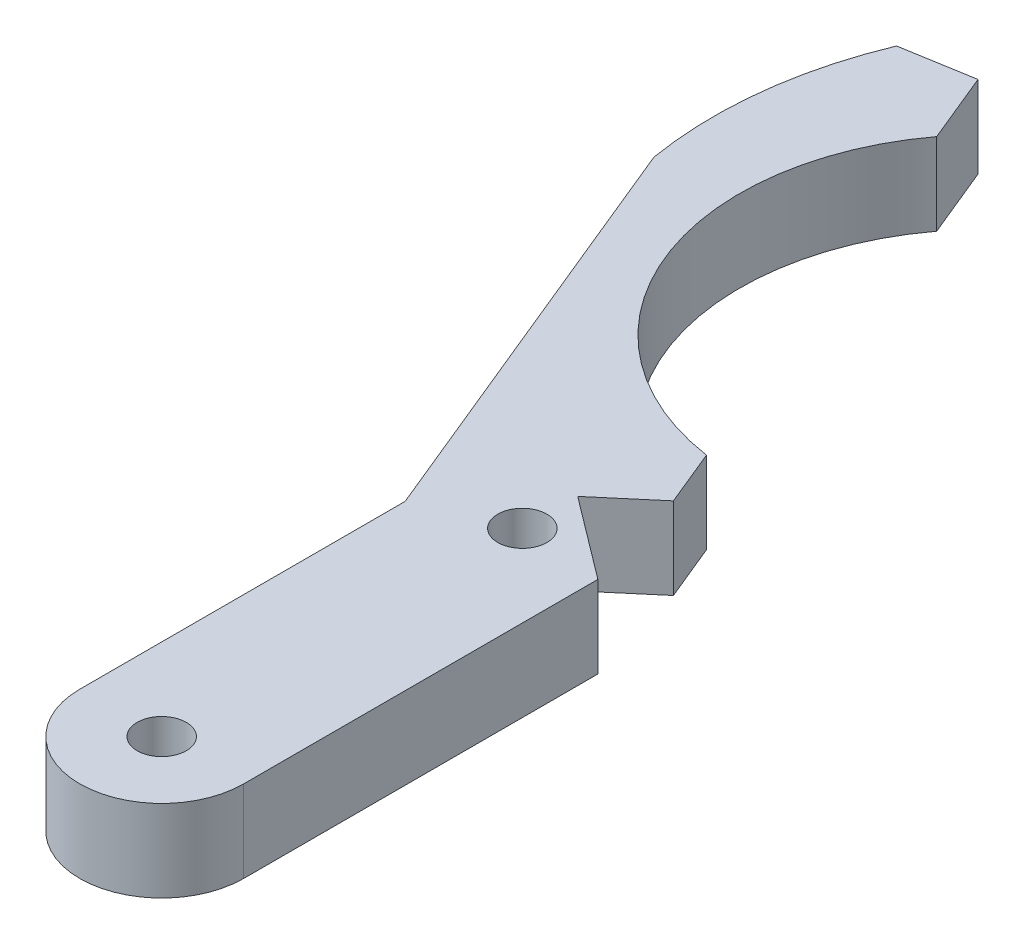
ISO-10303-21;
HEADER;
FILE_DESCRIPTION(('STEP AP214'),'2;1');
FILE_NAME('part.step','',(''),(''),'','','');
FILE_SCHEMA(('AUTOMOTIVE_DESIGN { 1 0 10303 214 1 1 1 1 }'));
ENDSEC;
DATA;
#1=APPLICATION_CONTEXT('core data for automotive mechanical design processes');
#2=APPLICATION_PROTOCOL_DEFINITION('international standard','automotive_design',2000,#1);
#3=PRODUCT_CONTEXT('',#1,'mechanical');
#4=PRODUCT('Part','Part','',(#3));
#5=PRODUCT_RELATED_PRODUCT_CATEGORY('part','',(#4));
#6=PRODUCT_DEFINITION_FORMATION('','',#4);
#7=PRODUCT_DEFINITION_CONTEXT('part definition',#1,'design');
#8=PRODUCT_DEFINITION('design','',#6,#7);
#9=PRODUCT_DEFINITION_SHAPE('','',#8);
#10=(LENGTH_UNIT() NAMED_UNIT(*) SI_UNIT(.MILLI.,.METRE.));
#11=(NAMED_UNIT(*) PLANE_ANGLE_UNIT() SI_UNIT($,.RADIAN.));
#12=(NAMED_UNIT(*) SI_UNIT($,.STERADIAN.) SOLID_ANGLE_UNIT());
#13=UNCERTAINTY_MEASURE_WITH_UNIT(LENGTH_MEASURE(1.E-05),#10,'distance_accuracy_value','');
#14=(GEOMETRIC_REPRESENTATION_CONTEXT(3) GLOBAL_UNCERTAINTY_ASSIGNED_CONTEXT((#13)) GLOBAL_UNIT_ASSIGNED_CONTEXT((#10,
#11,#12)) REPRESENTATION_CONTEXT('',''));
#15=CARTESIAN_POINT('',(0.,0.,0.));
#16=DIRECTION('',(0.,0.,1.));
#17=DIRECTION('',(1.,0.,0.));
#18=AXIS2_PLACEMENT_3D('',#15,#16,#17);
#19=CARTESIAN_POINT('',(-19.3539708974795,5.,7.95737946821825));
#20=DIRECTION('',(-0.924878228166552,0.,0.380263412733199));
#21=DIRECTION('',(0.380263412733199,0.,0.924878228166552));
#22=AXIS2_PLACEMENT_3D('',#19,#20,#21);
#23=PLANE('',#22);
#24=DIRECTION('',(-0.380263412733199,0.,-0.924878228166552));
#25=VECTOR('',#24,1.);
#26=CARTESIAN_POINT('',(-19.3539708974795,0.,7.95737946821825));
#27=LINE('',#26,#25);
#28=CARTESIAN_POINT('',(-30.7869668246445,0.,-19.85));
#29=VERTEX_POINT('',#28);
#30=CARTESIAN_POINT('',(-41.3848327885787,0.,-45.6261729550014));
#31=VERTEX_POINT('',#30);
#32=EDGE_CURVE('E154',#29,#31,#27,.T.);
#33=ORIENTED_EDGE('',*,*,#32,.F.);
#34=DIRECTION('',(0.,-1.,0.));
#35=VECTOR('',#34,1.);
#36=CARTESIAN_POINT('',(-30.7869668246445,5.,-19.85));
#37=LINE('',#36,#35);
#38=CARTESIAN_POINT('',(-30.7869668246445,5.,-19.85));
#39=VERTEX_POINT('',#38);
#40=EDGE_CURVE('E11',#39,#29,#37,.T.);
#41=ORIENTED_EDGE('',*,*,#40,.F.);
#42=DIRECTION('',(-0.380263412733199,0.,-0.924878228166552));
#43=VECTOR('',#42,1.);
#44=CARTESIAN_POINT('',(-19.3539708974795,5.,7.95737946821825));
#45=LINE('',#44,#43);
#46=CARTESIAN_POINT('',(-41.3848327885787,5.,-45.6261729550014));
#47=VERTEX_POINT('',#46);
#48=EDGE_CURVE('E187',#39,#47,#45,.T.);
#49=ORIENTED_EDGE('',*,*,#48,.T.);
#50=DIRECTION('',(0.,-1.,0.));
#51=VECTOR('',#50,1.);
#52=CARTESIAN_POINT('',(-41.3848327885787,5.,-45.6261729550014));
#53=LINE('',#52,#51);
#54=EDGE_CURVE('E51',#47,#31,#53,.T.);
#55=ORIENTED_EDGE('',*,*,#54,.T.);
#56=EDGE_LOOP('',(#33,#41,#49,#55));
#57=FACE_BOUND('',#56,.T.);
#58=ADVANCED_FACE('F35',(#57),#23,.T.);
#59=CARTESIAN_POINT('',(-30.7869668246445,5.,0.));
#60=DIRECTION('',(1.,0.,0.));
#61=DIRECTION('',(0.,0.,-1.));
#62=AXIS2_PLACEMENT_3D('',#59,#60,#61);
#63=PLANE('',#62);
#64=DIRECTION('',(0.,0.,1.));
#65=VECTOR('',#64,1.);
#66=CARTESIAN_POINT('',(-30.7869668246445,0.,0.));
#67=LINE('',#66,#65);
#68=CARTESIAN_POINT('',(-30.7869668246445,0.,0.));
#69=VERTEX_POINT('',#68);
#70=EDGE_CURVE('E156',#29,#69,#67,.T.);
#71=ORIENTED_EDGE('',*,*,#70,.T.);
#72=DIRECTION('',(0.,-1.,0.));
#73=VECTOR('',#72,1.);
#74=CARTESIAN_POINT('',(-30.7869668246445,5.,0.));
#75=LINE('',#74,#73);
#76=CARTESIAN_POINT('',(-30.7869668246445,5.,0.));
#77=VERTEX_POINT('',#76);
#78=EDGE_CURVE('E43',#77,#69,#75,.T.);
#79=ORIENTED_EDGE('',*,*,#78,.F.);
#80=DIRECTION('',(0.,0.,1.));
#81=VECTOR('',#80,1.);
#82=CARTESIAN_POINT('',(-30.7869668246445,5.,0.));
#83=LINE('',#82,#81);
#84=EDGE_CURVE('E228',#39,#77,#83,.T.);
#85=ORIENTED_EDGE('',*,*,#84,.F.);
#86=ORIENTED_EDGE('',*,*,#40,.T.);
#87=EDGE_LOOP('',(#71,#79,#85,#86));
#88=FACE_BOUND('',#87,.T.);
#89=ADVANCED_FACE('F254',(#88),#63,.F.);
#90=CARTESIAN_POINT('',(-25.7869668246445,5.,0.));
#91=DIRECTION('',(0.,-1.,0.));
#92=DIRECTION('',(0.,0.,-1.));
#93=AXIS2_PLACEMENT_3D('',#90,#91,#92);
#94=CYLINDRICAL_SURFACE('',#93,5.);
#95=CARTESIAN_POINT('',(-25.7869668246445,0.,0.));
#96=DIRECTION('',(0.,1.,0.));
#97=DIRECTION('',(0.,0.,1.));
#98=AXIS2_PLACEMENT_3D('',#95,#96,#97);
#99=CIRCLE('',#98,5.);
#100=CARTESIAN_POINT('',(-20.7869668246445,0.,0.));
#101=VERTEX_POINT('',#100);
#102=EDGE_CURVE('E158',#69,#101,#99,.T.);
#103=ORIENTED_EDGE('',*,*,#102,.T.);
#104=DIRECTION('',(0.,-1.,0.));
#105=VECTOR('',#104,1.);
#106=CARTESIAN_POINT('',(-20.7869668246445,5.,0.));
#107=LINE('',#106,#105);
#108=CARTESIAN_POINT('',(-20.7869668246445,5.,0.));
#109=VERTEX_POINT('',#108);
#110=EDGE_CURVE('E199',#109,#101,#107,.T.);
#111=ORIENTED_EDGE('',*,*,#110,.F.);
#112=CARTESIAN_POINT('',(-25.7869668246445,5.,0.));
#113=DIRECTION('',(0.,1.,0.));
#114=DIRECTION('',(0.,0.,1.));
#115=AXIS2_PLACEMENT_3D('',#112,#113,#114);
#116=CIRCLE('',#115,5.);
#117=EDGE_CURVE('E208',#77,#109,#116,.T.);
#118=ORIENTED_EDGE('',*,*,#117,.F.);
#119=ORIENTED_EDGE('',*,*,#78,.T.);
#120=EDGE_LOOP('',(#103,#111,#118,#119));
#121=FACE_BOUND('',#120,.T.);
#122=ADVANCED_FACE('F206',(#121),#94,.T.);
#123=CARTESIAN_POINT('',(-20.7869668246445,5.,0.));
#124=DIRECTION('',(-1.,0.,0.));
#125=DIRECTION('',(0.,0.,1.));
#126=AXIS2_PLACEMENT_3D('',#123,#124,#125);
#127=PLANE('',#126);
#128=DIRECTION('',(0.,0.,-1.));
#129=VECTOR('',#128,1.);
#130=CARTESIAN_POINT('',(-20.7869668246445,0.,0.));
#131=LINE('',#130,#129);
#132=CARTESIAN_POINT('',(-20.7869668246445,0.,-21.608298201415));
#133=VERTEX_POINT('',#132);
#134=EDGE_CURVE('E160',#101,#133,#131,.T.);
#135=ORIENTED_EDGE('',*,*,#134,.T.);
#136=DIRECTION('',(0.,-1.,0.));
#137=VECTOR('',#136,1.);
#138=CARTESIAN_POINT('',(-20.7869668246445,5.,-21.608298201415));
#139=LINE('',#138,#137);
#140=CARTESIAN_POINT('',(-20.7869668246445,5.,-21.608298201415));
#141=VERTEX_POINT('',#140);
#142=EDGE_CURVE('E197',#141,#133,#139,.T.);
#143=ORIENTED_EDGE('',*,*,#142,.F.);
#144=DIRECTION('',(0.,0.,-1.));
#145=VECTOR('',#144,1.);
#146=CARTESIAN_POINT('',(-20.7869668246445,5.,0.));
#147=LINE('',#146,#145);
#148=EDGE_CURVE('E222',#109,#141,#147,.T.);
#149=ORIENTED_EDGE('',*,*,#148,.F.);
#150=ORIENTED_EDGE('',*,*,#110,.T.);
#151=EDGE_LOOP('',(#135,#143,#149,#150));
#152=FACE_BOUND('',#151,.T.);
#153=ADVANCED_FACE('F219',(#152),#127,.F.);
#154=CARTESIAN_POINT('',(2.85580570279431,5.,-3.7891314117355));
#155=DIRECTION('',(0.601880940449397,0.,-0.7985858335356));
#156=DIRECTION('',(-0.7985858335356,0.,-0.601880940449397));
#157=AXIS2_PLACEMENT_3D('',#154,#155,#156);
#158=PLANE('',#157);
#159=DIRECTION('',(0.7985858335356,0.,0.601880940449397));
#160=VECTOR('',#159,1.);
#161=CARTESIAN_POINT('',(2.85580570279431,0.,-3.7891314117355));
#162=LINE('',#161,#160);
#163=CARTESIAN_POINT('',(-25.7869668246445,0.,-25.3767155410056));
#164=VERTEX_POINT('',#163);
#165=EDGE_CURVE('E163',#164,#133,#162,.T.);
#166=ORIENTED_EDGE('',*,*,#165,.F.);
#167=DIRECTION('',(0.,-1.,0.));
#168=VECTOR('',#167,1.);
#169=CARTESIAN_POINT('',(-25.7869668246445,5.,-25.3767155410056));
#170=LINE('',#169,#168);
#171=CARTESIAN_POINT('',(-25.7869668246445,5.,-25.3767155410056));
#172=VERTEX_POINT('',#171);
#173=EDGE_CURVE('E195',#172,#164,#170,.T.);
#174=ORIENTED_EDGE('',*,*,#173,.F.);
#175=DIRECTION('',(0.7985858335356,0.,0.601880940449397));
#176=VECTOR('',#175,1.);
#177=CARTESIAN_POINT('',(2.85580570279431,5.,-3.7891314117355));
#178=LINE('',#177,#176);
#179=EDGE_CURVE('E224',#172,#141,#178,.T.);
#180=ORIENTED_EDGE('',*,*,#179,.T.);
#181=ORIENTED_EDGE('',*,*,#142,.T.);
#182=EDGE_LOOP('',(#166,#174,#180,#181));
#183=FACE_BOUND('',#182,.T.);
#184=ADVANCED_FACE('F265',(#183),#158,.T.);
#185=CARTESIAN_POINT('',(-23.332682674699,5.,-27.4619645128153));
#186=DIRECTION('',(-0.64748750806212,0.,-0.762076063725601));
#187=DIRECTION('',(-0.762076063725601,0.,0.64748750806212));
#188=AXIS2_PLACEMENT_3D('',#185,#186,#187);
#189=PLANE('',#188);
#190=DIRECTION('',(0.762076063725601,0.,-0.64748750806212));
#191=VECTOR('',#190,1.);
#192=CARTESIAN_POINT('',(-23.332682674699,0.,-27.4619645128153));
#193=LINE('',#192,#191);
#194=CARTESIAN_POINT('',(-22.6307086528588,0.,-28.0583871427345));
#195=VERTEX_POINT('',#194);
#196=EDGE_CURVE('E166',#164,#195,#193,.T.);
#197=ORIENTED_EDGE('',*,*,#196,.T.);
#198=DIRECTION('',(0.,-1.,0.));
#199=VECTOR('',#198,1.);
#200=CARTESIAN_POINT('',(-22.6307086528588,5.,-28.0583871427345));
#201=LINE('',#200,#199);
#202=CARTESIAN_POINT('',(-22.6307086528588,5.,-28.0583871427345));
#203=VERTEX_POINT('',#202);
#204=EDGE_CURVE('E193',#203,#195,#201,.T.);
#205=ORIENTED_EDGE('',*,*,#204,.F.);
#206=DIRECTION('',(0.762076063725601,0.,-0.64748750806212));
#207=VECTOR('',#206,1.);
#208=CARTESIAN_POINT('',(-23.332682674699,5.,-27.4619645128153));
#209=LINE('',#208,#207);
#210=EDGE_CURVE('E226',#172,#203,#209,.T.);
#211=ORIENTED_EDGE('',*,*,#210,.F.);
#212=ORIENTED_EDGE('',*,*,#173,.T.);
#213=EDGE_LOOP('',(#197,#205,#211,#212));
#214=FACE_BOUND('',#213,.T.);
#215=ADVANCED_FACE('F268',(#214),#189,.F.);
#216=CARTESIAN_POINT('',(-9.49024178553923,5.,3.90191013165734));
#217=DIRECTION('',(0.924878228166552,0.,-0.380263412733199));
#218=DIRECTION('',(-0.380263412733199,0.,-0.924878228166552));
#219=AXIS2_PLACEMENT_3D('',#216,#217,#218);
#220=PLANE('',#219);
#221=DIRECTION('',(0.380263412733199,0.,0.924878228166552));
#222=VECTOR('',#221,1.);
#223=CARTESIAN_POINT('',(-9.49024178553923,0.,3.90191013165734));
#224=LINE('',#223,#222);
#225=CARTESIAN_POINT('',(-24.0396729020402,0.,-31.4852757538857));
#226=VERTEX_POINT('',#225);
#227=EDGE_CURVE('E169',#226,#195,#224,.T.);
#228=ORIENTED_EDGE('',*,*,#227,.F.);
#229=DIRECTION('',(0.,-1.,0.));
#230=VECTOR('',#229,1.);
#231=CARTESIAN_POINT('',(-24.0396729020402,5.,-31.4852757538857));
#232=LINE('',#231,#230);
#233=CARTESIAN_POINT('',(-24.0396729020402,5.,-31.4852757538857));
#234=VERTEX_POINT('',#233);
#235=EDGE_CURVE('E191',#234,#226,#232,.T.);
#236=ORIENTED_EDGE('',*,*,#235,.F.);
#237=DIRECTION('',(0.380263412733199,0.,0.924878228166552));
#238=VECTOR('',#237,1.);
#239=CARTESIAN_POINT('',(-9.49024178553923,5.,3.90191013165734));
#240=LINE('',#239,#238);
#241=EDGE_CURVE('E233',#234,#203,#240,.T.);
#242=ORIENTED_EDGE('',*,*,#241,.T.);
#243=ORIENTED_EDGE('',*,*,#204,.T.);
#244=EDGE_LOOP('',(#228,#236,#242,#243));
#245=FACE_BOUND('',#244,.T.);
#246=ADVANCED_FACE('F272',(#245),#220,.T.);
#247=CARTESIAN_POINT('',(-21.8510867924501,5.,-46.3247531988939));
#248=DIRECTION('',(0.,-1.,0.));
#249=DIRECTION('',(0.,0.,-1.));
#250=AXIS2_PLACEMENT_3D('',#247,#248,#249);
#251=CYLINDRICAL_SURFACE('',#250,15.);
#252=CARTESIAN_POINT('',(-21.8510867924501,0.,-46.3247531988939));
#253=DIRECTION('',(0.,1.,0.));
#254=DIRECTION('',(0.,0.,1.));
#255=AXIS2_PLACEMENT_3D('',#252,#253,#254);
#256=CIRCLE('',#255,15.);
#257=CARTESIAN_POINT('',(-33.8447424749671,0.,-55.3332060832258));
#258=VERTEX_POINT('',#257);
#259=EDGE_CURVE('E172',#258,#226,#256,.T.);
#260=ORIENTED_EDGE('',*,*,#259,.F.);
#261=DIRECTION('',(0.,-1.,0.));
#262=VECTOR('',#261,1.);
#263=CARTESIAN_POINT('',(-33.8447424749671,5.,-55.3332060832258));
#264=LINE('',#263,#262);
#265=CARTESIAN_POINT('',(-33.8447424749671,5.,-55.3332060832258));
#266=VERTEX_POINT('',#265);
#267=EDGE_CURVE('E128',#266,#258,#264,.T.);
#268=ORIENTED_EDGE('',*,*,#267,.F.);
#269=CARTESIAN_POINT('',(-21.8510867924501,5.,-46.3247531988939));
#270=DIRECTION('',(0.,1.,0.));
#271=DIRECTION('',(0.,0.,1.));
#272=AXIS2_PLACEMENT_3D('',#269,#270,#271);
#273=CIRCLE('',#272,15.);
#274=EDGE_CURVE('E140',#266,#234,#273,.T.);
#275=ORIENTED_EDGE('',*,*,#274,.T.);
#276=ORIENTED_EDGE('',*,*,#235,.T.);
#277=EDGE_LOOP('',(#260,#268,#275,#276));
#278=FACE_BOUND('',#277,.T.);
#279=ADVANCED_FACE('F237',(#278),#251,.F.);
#280=CARTESIAN_POINT('',(-9.49024178553925,5.,3.90191013165735));
#281=DIRECTION('',(0.924878228166552,0.,-0.380263412733199));
#282=DIRECTION('',(-0.380263412733199,0.,-0.924878228166552));
#283=AXIS2_PLACEMENT_3D('',#280,#281,#282);
#284=PLANE('',#283);
#285=DIRECTION('',(0.380263412733199,0.,0.924878228166552));
#286=VECTOR('',#285,1.);
#287=CARTESIAN_POINT('',(-9.49024178553925,0.,3.90191013165735));
#288=LINE('',#287,#286);
#289=CARTESIAN_POINT('',(-35.6041621929563,0.,-59.6124739193792));
#290=VERTEX_POINT('',#289);
#291=EDGE_CURVE('E124',#290,#258,#288,.T.);
#292=ORIENTED_EDGE('',*,*,#291,.F.);
#293=DIRECTION('',(0.,-1.,0.));
#294=VECTOR('',#293,1.);
#295=CARTESIAN_POINT('',(-35.6041621929563,5.,-59.6124739193792));
#296=LINE('',#295,#294);
#297=CARTESIAN_POINT('',(-35.6041621929563,5.,-59.6124739193792));
#298=VERTEX_POINT('',#297);
#299=EDGE_CURVE('E119',#298,#290,#296,.T.);
#300=ORIENTED_EDGE('',*,*,#299,.F.);
#301=DIRECTION('',(0.380263412733199,0.,0.924878228166552));
#302=VECTOR('',#301,1.);
#303=CARTESIAN_POINT('',(-9.49024178553925,5.,3.90191013165735));
#304=LINE('',#303,#302);
#305=EDGE_CURVE('E122',#298,#266,#304,.T.);
#306=ORIENTED_EDGE('',*,*,#305,.T.);
#307=ORIENTED_EDGE('',*,*,#267,.T.);
#308=EDGE_LOOP('',(#292,#300,#306,#307));
#309=FACE_BOUND('',#308,.T.);
#310=ADVANCED_FACE('F121',(#309),#284,.T.);
#311=CARTESIAN_POINT('',(-10.7735039071086,5.,-63.8051333499524));
#312=DIRECTION('',(-0.166493398173454,0.,-0.986042569245697));
#313=DIRECTION('',(-0.986042569245697,0.,0.166493398173454));
#314=AXIS2_PLACEMENT_3D('',#311,#312,#313);
#315=PLANE('',#314);
#316=DIRECTION('',(0.986042569245697,0.,-0.166493398173454));
#317=VECTOR('',#316,1.);
#318=CARTESIAN_POINT('',(-10.7735039071086,0.,-63.8051333499524));
#319=LINE('',#318,#317);
#320=CARTESIAN_POINT('',(-39.8540056664052,0.,-58.8948873732516));
#321=VERTEX_POINT('',#320);
#322=EDGE_CURVE('E176',#321,#290,#319,.T.);
#323=ORIENTED_EDGE('',*,*,#322,.F.);
#324=DIRECTION('',(0.,-1.,0.));
#325=VECTOR('',#324,1.);
#326=CARTESIAN_POINT('',(-39.8540056664052,5.,-58.8948873732516));
#327=LINE('',#326,#325);
#328=CARTESIAN_POINT('',(-39.8540056664052,5.,-58.8948873732516));
#329=VERTEX_POINT('',#328);
#330=EDGE_CURVE('E85',#329,#321,#327,.T.);
#331=ORIENTED_EDGE('',*,*,#330,.F.);
#332=DIRECTION('',(0.986042569245697,0.,-0.166493398173454));
#333=VECTOR('',#332,1.);
#334=CARTESIAN_POINT('',(-10.7735039071086,5.,-63.8051333499524));
#335=LINE('',#334,#333);
#336=EDGE_CURVE('E137',#329,#298,#335,.T.);
#337=ORIENTED_EDGE('',*,*,#336,.T.);
#338=ORIENTED_EDGE('',*,*,#299,.T.);
#339=EDGE_LOOP('',(#323,#331,#337,#338));
#340=FACE_BOUND('',#339,.T.);
#341=ADVANCED_FACE('F142',(#340),#315,.T.);
#342=CARTESIAN_POINT('',(-25.7869668246445,5.,-22.));
#343=DIRECTION('',(0.,-1.,0.));
#344=DIRECTION('',(0.,0.,-1.));
#345=AXIS2_PLACEMENT_3D('',#342,#343,#344);
#346=CYLINDRICAL_SURFACE('',#345,1.5);
#347=CARTESIAN_POINT('',(-25.7869668246445,5.,-22.));
#348=DIRECTION('',(0.,1.,0.));
#349=DIRECTION('',(0.,0.,1.));
#350=AXIS2_PLACEMENT_3D('',#347,#348,#349);
#351=CIRCLE('',#350,1.5);
#352=CARTESIAN_POINT('',(-25.7869668246445,5.,-20.5));
#353=VERTEX_POINT('',#352);
#354=EDGE_CURVE('E145',#353,#353,#351,.T.);
#355=ORIENTED_EDGE('',*,*,#354,.T.);
#356=EDGE_LOOP('',(#355));
#357=FACE_BOUND('',#356,.T.);
#358=CARTESIAN_POINT('',(-25.7869668246445,0.,-22.));
#359=DIRECTION('',(0.,1.,0.));
#360=DIRECTION('',(0.,0.,1.));
#361=AXIS2_PLACEMENT_3D('',#358,#359,#360);
#362=CIRCLE('',#361,1.5);
#363=CARTESIAN_POINT('',(-25.7869668246445,0.,-20.5));
#364=VERTEX_POINT('',#363);
#365=EDGE_CURVE('E181',#364,#364,#362,.T.);
#366=ORIENTED_EDGE('',*,*,#365,.F.);
#367=EDGE_LOOP('',(#366));
#368=FACE_BOUND('',#367,.T.);
#369=ADVANCED_FACE('F242',(#357,#368),#346,.F.);
#370=CARTESIAN_POINT('',(-17.5678322239147,5.,-49.6010415745098));
#371=DIRECTION('',(0.,-1.,0.));
#372=DIRECTION('',(0.,0.,-1.));
#373=AXIS2_PLACEMENT_3D('',#370,#371,#372);
#374=CYLINDRICAL_SURFACE('',#373,24.1464095972789);
#375=CARTESIAN_POINT('',(-17.5678322239147,0.,-49.6010415745098));
#376=DIRECTION('',(0.,1.,0.));
#377=DIRECTION('',(0.,0.,1.));
#378=AXIS2_PLACEMENT_3D('',#375,#376,#377);
#379=CIRCLE('',#378,24.1464095972789);
#380=EDGE_CURVE('E178',#31,#321,#379,.F.);
#381=ORIENTED_EDGE('',*,*,#380,.F.);
#382=ORIENTED_EDGE('',*,*,#54,.F.);
#383=CARTESIAN_POINT('',(-17.5678322239147,5.,-49.6010415745098));
#384=DIRECTION('',(0.,1.,0.));
#385=DIRECTION('',(0.,0.,1.));
#386=AXIS2_PLACEMENT_3D('',#383,#384,#385);
#387=CIRCLE('',#386,24.1464095972789);
#388=EDGE_CURVE('E143',#47,#329,#387,.F.);
#389=ORIENTED_EDGE('',*,*,#388,.T.);
#390=ORIENTED_EDGE('',*,*,#330,.T.);
#391=EDGE_LOOP('',(#381,#382,#389,#390));
#392=FACE_BOUND('',#391,.T.);
#393=ADVANCED_FACE('F239',(#392),#374,.T.);
#394=CARTESIAN_POINT('',(-25.7869668246445,5.,0.));
#395=DIRECTION('',(0.,-1.,0.));
#396=DIRECTION('',(0.,0.,-1.));
#397=AXIS2_PLACEMENT_3D('',#394,#395,#396);
#398=CYLINDRICAL_SURFACE('',#397,1.5);
#399=CARTESIAN_POINT('',(-25.7869668246445,5.,0.));
#400=DIRECTION('',(0.,1.,0.));
#401=DIRECTION('',(0.,0.,1.));
#402=AXIS2_PLACEMENT_3D('',#399,#400,#401);
#403=CIRCLE('',#402,1.5);
#404=CARTESIAN_POINT('',(-25.7869668246445,5.,1.5));
#405=VERTEX_POINT('',#404);
#406=EDGE_CURVE('E151',#405,#405,#403,.T.);
#407=ORIENTED_EDGE('',*,*,#406,.T.);
#408=EDGE_LOOP('',(#407));
#409=FACE_BOUND('',#408,.T.);
#410=CARTESIAN_POINT('',(-25.7869668246445,0.,0.));
#411=DIRECTION('',(0.,1.,0.));
#412=DIRECTION('',(0.,0.,1.));
#413=AXIS2_PLACEMENT_3D('',#410,#411,#412);
#414=CIRCLE('',#413,1.5);
#415=CARTESIAN_POINT('',(-25.7869668246445,0.,1.5));
#416=VERTEX_POINT('',#415);
#417=EDGE_CURVE('E184',#416,#416,#414,.T.);
#418=ORIENTED_EDGE('',*,*,#417,.F.);
#419=EDGE_LOOP('',(#418));
#420=FACE_BOUND('',#419,.T.);
#421=ADVANCED_FACE('F241',(#409,#420),#398,.F.);
#422=CARTESIAN_POINT('',(0.,5.,0.));
#423=DIRECTION('',(0.,1.,0.));
#424=DIRECTION('',(0.,0.,1.));
#425=AXIS2_PLACEMENT_3D('',#422,#423,#424);
#426=PLANE('',#425);
#427=ORIENTED_EDGE('',*,*,#48,.F.);
#428=ORIENTED_EDGE('',*,*,#84,.T.);
#429=ORIENTED_EDGE('',*,*,#117,.T.);
#430=ORIENTED_EDGE('',*,*,#148,.T.);
#431=ORIENTED_EDGE('',*,*,#179,.F.);
#432=ORIENTED_EDGE('',*,*,#210,.T.);
#433=ORIENTED_EDGE('',*,*,#241,.F.);
#434=ORIENTED_EDGE('',*,*,#274,.F.);
#435=ORIENTED_EDGE('',*,*,#305,.F.);
#436=ORIENTED_EDGE('',*,*,#336,.F.);
#437=ORIENTED_EDGE('',*,*,#388,.F.);
#438=EDGE_LOOP('',(#427,#428,#429,#430,#431,#432,#433,#434,#435,#436,#437));
#439=FACE_BOUND('',#438,.T.);
#440=ORIENTED_EDGE('',*,*,#354,.F.);
#441=EDGE_LOOP('',(#440));
#442=FACE_BOUND('',#441,.T.);
#443=ORIENTED_EDGE('',*,*,#406,.F.);
#444=EDGE_LOOP('',(#443));
#445=FACE_BOUND('',#444,.T.);
#446=ADVANCED_FACE('F134',(#439,#442,#445),#426,.T.);
#447=CARTESIAN_POINT('',(0.,0.,0.));
#448=DIRECTION('',(0.,1.,0.));
#449=DIRECTION('',(0.,0.,1.));
#450=AXIS2_PLACEMENT_3D('',#447,#448,#449);
#451=PLANE('',#450);
#452=ORIENTED_EDGE('',*,*,#32,.T.);
#453=ORIENTED_EDGE('',*,*,#380,.T.);
#454=ORIENTED_EDGE('',*,*,#322,.T.);
#455=ORIENTED_EDGE('',*,*,#291,.T.);
#456=ORIENTED_EDGE('',*,*,#259,.T.);
#457=ORIENTED_EDGE('',*,*,#227,.T.);
#458=ORIENTED_EDGE('',*,*,#196,.F.);
#459=ORIENTED_EDGE('',*,*,#165,.T.);
#460=ORIENTED_EDGE('',*,*,#134,.F.);
#461=ORIENTED_EDGE('',*,*,#102,.F.);
#462=ORIENTED_EDGE('',*,*,#70,.F.);
#463=EDGE_LOOP('',(#452,#453,#454,#455,#456,#457,#458,#459,#460,#461,#462));
#464=FACE_BOUND('',#463,.T.);
#465=ORIENTED_EDGE('',*,*,#365,.T.);
#466=EDGE_LOOP('',(#465));
#467=FACE_BOUND('',#466,.T.);
#468=ORIENTED_EDGE('',*,*,#417,.T.);
#469=EDGE_LOOP('',(#468));
#470=FACE_BOUND('',#469,.T.);
#471=ADVANCED_FACE('F213',(#464,#467,#470),#451,.F.);
#472=CLOSED_SHELL('',(#58,#89,#122,#153,#184,#215,#246,#279,#310,#341,#369,#393,#421,#446,#471));
#473=MANIFOLD_SOLID_BREP('B2',#472);
#474=ADVANCED_BREP_SHAPE_REPRESENTATION('',(#18,#473),#14);
#475=SHAPE_DEFINITION_REPRESENTATION(#9,#474);
ENDSEC;
END-ISO-10303-21;
